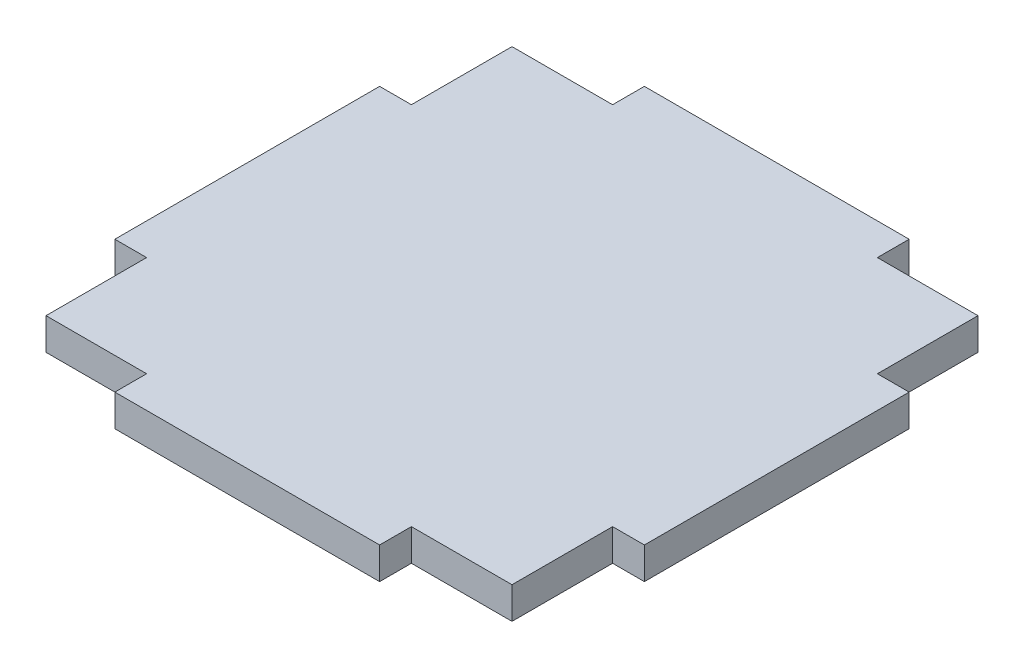
ISO-10303-21;
HEADER;
FILE_DESCRIPTION(('STEP AP214'),'2;1');
FILE_NAME('part.step','',(''),(''),'','','');
FILE_SCHEMA(('AUTOMOTIVE_DESIGN { 1 0 10303 214 1 1 1 1 }'));
ENDSEC;
DATA;
#1=APPLICATION_CONTEXT('core data for automotive mechanical design processes');
#2=APPLICATION_PROTOCOL_DEFINITION('international standard','automotive_design',2000,#1);
#3=PRODUCT_CONTEXT('',#1,'mechanical');
#4=PRODUCT('Part','Part','',(#3));
#5=PRODUCT_RELATED_PRODUCT_CATEGORY('part','',(#4));
#6=PRODUCT_DEFINITION_FORMATION('','',#4);
#7=PRODUCT_DEFINITION_CONTEXT('part definition',#1,'design');
#8=PRODUCT_DEFINITION('design','',#6,#7);
#9=PRODUCT_DEFINITION_SHAPE('','',#8);
#10=(LENGTH_UNIT() NAMED_UNIT(*) SI_UNIT(.MILLI.,.METRE.));
#11=(NAMED_UNIT(*) PLANE_ANGLE_UNIT() SI_UNIT($,.RADIAN.));
#12=(NAMED_UNIT(*) SI_UNIT($,.STERADIAN.) SOLID_ANGLE_UNIT());
#13=UNCERTAINTY_MEASURE_WITH_UNIT(LENGTH_MEASURE(1.E-05),#10,'distance_accuracy_value','');
#14=(GEOMETRIC_REPRESENTATION_CONTEXT(3) GLOBAL_UNCERTAINTY_ASSIGNED_CONTEXT((#13)) GLOBAL_UNIT_ASSIGNED_CONTEXT((#10,
#11,#12)) REPRESENTATION_CONTEXT('',''));
#15=CARTESIAN_POINT('',(0.,0.,0.));
#16=DIRECTION('',(0.,0.,1.));
#17=DIRECTION('',(1.,0.,0.));
#18=AXIS2_PLACEMENT_3D('',#15,#16,#17);
#19=CARTESIAN_POINT('',(0.,3.,0.));
#20=DIRECTION('',(1.,0.,0.));
#21=DIRECTION('',(0.,0.,-1.));
#22=AXIS2_PLACEMENT_3D('',#19,#20,#21);
#23=PLANE('',#22);
#24=DIRECTION('',(0.,0.,1.));
#25=VECTOR('',#24,1.);
#26=CARTESIAN_POINT('',(0.,0.,0.));
#27=LINE('',#26,#25);
#28=CARTESIAN_POINT('',(0.,0.,-37.5));
#29=VERTEX_POINT('',#28);
#30=CARTESIAN_POINT('',(0.,0.,-12.5));
#31=VERTEX_POINT('',#30);
#32=EDGE_CURVE('E201',#29,#31,#27,.T.);
#33=ORIENTED_EDGE('',*,*,#32,.T.);
#34=DIRECTION('',(0.,1.,0.));
#35=VECTOR('',#34,1.);
#36=CARTESIAN_POINT('',(0.,0.,-12.5));
#37=LINE('',#36,#35);
#38=CARTESIAN_POINT('',(0.,3.,-12.5));
#39=VERTEX_POINT('',#38);
#40=EDGE_CURVE('E237',#31,#39,#37,.T.);
#41=ORIENTED_EDGE('',*,*,#40,.T.);
#42=DIRECTION('',(0.,0.,1.));
#43=VECTOR('',#42,1.);
#44=CARTESIAN_POINT('',(0.,3.,0.));
#45=LINE('',#44,#43);
#46=CARTESIAN_POINT('',(0.,3.,-37.5));
#47=VERTEX_POINT('',#46);
#48=EDGE_CURVE('E211',#47,#39,#45,.T.);
#49=ORIENTED_EDGE('',*,*,#48,.F.);
#50=DIRECTION('',(0.,1.,0.));
#51=VECTOR('',#50,1.);
#52=CARTESIAN_POINT('',(0.,0.,-37.5));
#53=LINE('',#52,#51);
#54=EDGE_CURVE('E214',#29,#47,#53,.T.);
#55=ORIENTED_EDGE('',*,*,#54,.F.);
#56=EDGE_LOOP('',(#33,#41,#49,#55));
#57=FACE_BOUND('',#56,.T.);
#58=ADVANCED_FACE('F33',(#57),#23,.F.);
#59=CARTESIAN_POINT('',(0.,3.,0.));
#60=DIRECTION('',(0.,0.,-1.));
#61=DIRECTION('',(-1.,0.,0.));
#62=AXIS2_PLACEMENT_3D('',#59,#60,#61);
#63=PLANE('',#62);
#64=DIRECTION('',(1.,0.,0.));
#65=VECTOR('',#64,1.);
#66=CARTESIAN_POINT('',(0.,0.,0.));
#67=LINE('',#66,#65);
#68=CARTESIAN_POINT('',(12.5,0.,0.));
#69=VERTEX_POINT('',#68);
#70=CARTESIAN_POINT('',(37.5,0.,0.));
#71=VERTEX_POINT('',#70);
#72=EDGE_CURVE('E189',#69,#71,#67,.T.);
#73=ORIENTED_EDGE('',*,*,#72,.T.);
#74=DIRECTION('',(0.,1.,0.));
#75=VECTOR('',#74,1.);
#76=CARTESIAN_POINT('',(37.5,0.,0.));
#77=LINE('',#76,#75);
#78=CARTESIAN_POINT('',(37.5,3.,0.));
#79=VERTEX_POINT('',#78);
#80=EDGE_CURVE('E288',#71,#79,#77,.T.);
#81=ORIENTED_EDGE('',*,*,#80,.T.);
#82=DIRECTION('',(1.,0.,0.));
#83=VECTOR('',#82,1.);
#84=CARTESIAN_POINT('',(0.,3.,0.));
#85=LINE('',#84,#83);
#86=CARTESIAN_POINT('',(12.5,3.,0.));
#87=VERTEX_POINT('',#86);
#88=EDGE_CURVE('E191',#87,#79,#85,.T.);
#89=ORIENTED_EDGE('',*,*,#88,.F.);
#90=DIRECTION('',(0.,1.,0.));
#91=VECTOR('',#90,1.);
#92=CARTESIAN_POINT('',(12.5,0.,0.));
#93=LINE('',#92,#91);
#94=EDGE_CURVE('E175',#69,#87,#93,.T.);
#95=ORIENTED_EDGE('',*,*,#94,.F.);
#96=EDGE_LOOP('',(#73,#81,#89,#95));
#97=FACE_BOUND('',#96,.T.);
#98=ADVANCED_FACE('F187',(#97),#63,.F.);
#99=CARTESIAN_POINT('',(50.,3.,0.));
#100=DIRECTION('',(-1.,0.,0.));
#101=DIRECTION('',(0.,0.,1.));
#102=AXIS2_PLACEMENT_3D('',#99,#100,#101);
#103=PLANE('',#102);
#104=DIRECTION('',(0.,0.,-1.));
#105=VECTOR('',#104,1.);
#106=CARTESIAN_POINT('',(50.,0.,0.));
#107=LINE('',#106,#105);
#108=CARTESIAN_POINT('',(50.,0.,-12.5));
#109=VERTEX_POINT('',#108);
#110=CARTESIAN_POINT('',(50.,0.,-37.5));
#111=VERTEX_POINT('',#110);
#112=EDGE_CURVE('E200',#109,#111,#107,.T.);
#113=ORIENTED_EDGE('',*,*,#112,.T.);
#114=DIRECTION('',(0.,1.,0.));
#115=VECTOR('',#114,1.);
#116=CARTESIAN_POINT('',(50.,0.,-37.5));
#117=LINE('',#116,#115);
#118=CARTESIAN_POINT('',(50.,3.,-37.5));
#119=VERTEX_POINT('',#118);
#120=EDGE_CURVE('E257',#111,#119,#117,.T.);
#121=ORIENTED_EDGE('',*,*,#120,.T.);
#122=DIRECTION('',(0.,0.,-1.));
#123=VECTOR('',#122,1.);
#124=CARTESIAN_POINT('',(50.,3.,0.));
#125=LINE('',#124,#123);
#126=CARTESIAN_POINT('',(50.,3.,-12.5));
#127=VERTEX_POINT('',#126);
#128=EDGE_CURVE('E41',#127,#119,#125,.T.);
#129=ORIENTED_EDGE('',*,*,#128,.F.);
#130=DIRECTION('',(0.,1.,0.));
#131=VECTOR('',#130,1.);
#132=CARTESIAN_POINT('',(50.,0.,-12.5));
#133=LINE('',#132,#131);
#134=EDGE_CURVE('E280',#109,#127,#133,.T.);
#135=ORIENTED_EDGE('',*,*,#134,.F.);
#136=EDGE_LOOP('',(#113,#121,#129,#135));
#137=FACE_BOUND('',#136,.T.);
#138=ADVANCED_FACE('F381',(#137),#103,.F.);
#139=CARTESIAN_POINT('',(0.,3.,-50.));
#140=DIRECTION('',(0.,0.,1.));
#141=DIRECTION('',(1.,0.,0.));
#142=AXIS2_PLACEMENT_3D('',#139,#140,#141);
#143=PLANE('',#142);
#144=DIRECTION('',(-1.,0.,0.));
#145=VECTOR('',#144,1.);
#146=CARTESIAN_POINT('',(0.,3.,-50.));
#147=LINE('',#146,#145);
#148=CARTESIAN_POINT('',(37.5,3.,-50.));
#149=VERTEX_POINT('',#148);
#150=CARTESIAN_POINT('',(12.5,3.,-50.));
#151=VERTEX_POINT('',#150);
#152=EDGE_CURVE('E11',#149,#151,#147,.T.);
#153=ORIENTED_EDGE('',*,*,#152,.F.);
#154=DIRECTION('',(0.,1.,0.));
#155=VECTOR('',#154,1.);
#156=CARTESIAN_POINT('',(37.5,0.,-50.));
#157=LINE('',#156,#155);
#158=CARTESIAN_POINT('',(37.5,0.,-50.));
#159=VERTEX_POINT('',#158);
#160=EDGE_CURVE('E248',#159,#149,#157,.T.);
#161=ORIENTED_EDGE('',*,*,#160,.F.);
#162=DIRECTION('',(-1.,0.,0.));
#163=VECTOR('',#162,1.);
#164=CARTESIAN_POINT('',(0.,0.,-50.));
#165=LINE('',#164,#163);
#166=CARTESIAN_POINT('',(12.5,0.,-50.));
#167=VERTEX_POINT('',#166);
#168=EDGE_CURVE('E36',#159,#167,#165,.T.);
#169=ORIENTED_EDGE('',*,*,#168,.T.);
#170=DIRECTION('',(0.,1.,0.));
#171=VECTOR('',#170,1.);
#172=CARTESIAN_POINT('',(12.5,0.,-50.));
#173=LINE('',#172,#171);
#174=EDGE_CURVE('E205',#167,#151,#173,.T.);
#175=ORIENTED_EDGE('',*,*,#174,.T.);
#176=EDGE_LOOP('',(#153,#161,#169,#175));
#177=FACE_BOUND('',#176,.T.);
#178=ADVANCED_FACE('F364',(#177),#143,.F.);
#179=CARTESIAN_POINT('',(0.,3.,0.));
#180=DIRECTION('',(0.,-1.,0.));
#181=DIRECTION('',(0.,0.,-1.));
#182=AXIS2_PLACEMENT_3D('',#179,#180,#181);
#183=PLANE('',#182);
#184=ORIENTED_EDGE('',*,*,#128,.T.);
#185=DIRECTION('',(1.,0.,0.));
#186=VECTOR('',#185,1.);
#187=CARTESIAN_POINT('',(50.,3.,-37.5));
#188=LINE('',#187,#186);
#189=CARTESIAN_POINT('',(47.,3.,-37.5));
#190=VERTEX_POINT('',#189);
#191=EDGE_CURVE('E261',#190,#119,#188,.T.);
#192=ORIENTED_EDGE('',*,*,#191,.F.);
#193=DIRECTION('',(0.,0.,1.));
#194=VECTOR('',#193,1.);
#195=CARTESIAN_POINT('',(47.,3.,-37.5));
#196=LINE('',#195,#194);
#197=CARTESIAN_POINT('',(47.,3.,-47.));
#198=VERTEX_POINT('',#197);
#199=EDGE_CURVE('E264',#198,#190,#196,.T.);
#200=ORIENTED_EDGE('',*,*,#199,.F.);
#201=DIRECTION('',(1.,0.,0.));
#202=VECTOR('',#201,1.);
#203=CARTESIAN_POINT('',(37.5,3.,-47.));
#204=LINE('',#203,#202);
#205=CARTESIAN_POINT('',(37.5,3.,-47.));
#206=VERTEX_POINT('',#205);
#207=EDGE_CURVE('E267',#206,#198,#204,.T.);
#208=ORIENTED_EDGE('',*,*,#207,.F.);
#209=DIRECTION('',(0.,0.,1.));
#210=VECTOR('',#209,1.);
#211=CARTESIAN_POINT('',(37.5,3.,-50.));
#212=LINE('',#211,#210);
#213=EDGE_CURVE('E270',#149,#206,#212,.T.);
#214=ORIENTED_EDGE('',*,*,#213,.F.);
#215=ORIENTED_EDGE('',*,*,#152,.T.);
#216=DIRECTION('',(0.,0.,-1.));
#217=VECTOR('',#216,1.);
#218=CARTESIAN_POINT('',(12.5,3.,-50.));
#219=LINE('',#218,#217);
#220=CARTESIAN_POINT('',(12.5,3.,-47.));
#221=VERTEX_POINT('',#220);
#222=EDGE_CURVE('E225',#221,#151,#219,.T.);
#223=ORIENTED_EDGE('',*,*,#222,.F.);
#224=DIRECTION('',(1.,0.,0.));
#225=VECTOR('',#224,1.);
#226=CARTESIAN_POINT('',(12.5,3.,-47.));
#227=LINE('',#226,#225);
#228=CARTESIAN_POINT('',(3.,3.,-47.));
#229=VERTEX_POINT('',#228);
#230=EDGE_CURVE('E228',#229,#221,#227,.T.);
#231=ORIENTED_EDGE('',*,*,#230,.F.);
#232=DIRECTION('',(0.,0.,-1.));
#233=VECTOR('',#232,1.);
#234=CARTESIAN_POINT('',(3.,3.,-37.5));
#235=LINE('',#234,#233);
#236=CARTESIAN_POINT('',(3.,3.,-37.5));
#237=VERTEX_POINT('',#236);
#238=EDGE_CURVE('E231',#237,#229,#235,.T.);
#239=ORIENTED_EDGE('',*,*,#238,.F.);
#240=DIRECTION('',(1.,0.,0.));
#241=VECTOR('',#240,1.);
#242=CARTESIAN_POINT('',(0.,3.,-37.5));
#243=LINE('',#242,#241);
#244=EDGE_CURVE('E234',#47,#237,#243,.T.);
#245=ORIENTED_EDGE('',*,*,#244,.F.);
#246=ORIENTED_EDGE('',*,*,#48,.T.);
#247=DIRECTION('',(-1.,0.,0.));
#248=VECTOR('',#247,1.);
#249=CARTESIAN_POINT('',(0.,3.,-12.5));
#250=LINE('',#249,#248);
#251=CARTESIAN_POINT('',(3.,3.,-12.5));
#252=VERTEX_POINT('',#251);
#253=EDGE_CURVE('E182',#252,#39,#250,.T.);
#254=ORIENTED_EDGE('',*,*,#253,.F.);
#255=DIRECTION('',(0.,0.,-1.));
#256=VECTOR('',#255,1.);
#257=CARTESIAN_POINT('',(3.,3.,-12.5));
#258=LINE('',#257,#256);
#259=CARTESIAN_POINT('',(3.,3.,-3.));
#260=VERTEX_POINT('',#259);
#261=EDGE_CURVE('E316',#260,#252,#258,.T.);
#262=ORIENTED_EDGE('',*,*,#261,.F.);
#263=DIRECTION('',(-1.,0.,0.));
#264=VECTOR('',#263,1.);
#265=CARTESIAN_POINT('',(12.5,3.,-3.));
#266=LINE('',#265,#264);
#267=CARTESIAN_POINT('',(12.5,3.,-3.));
#268=VERTEX_POINT('',#267);
#269=EDGE_CURVE('E319',#268,#260,#266,.T.);
#270=ORIENTED_EDGE('',*,*,#269,.F.);
#271=DIRECTION('',(0.,0.,-1.));
#272=VECTOR('',#271,1.);
#273=CARTESIAN_POINT('',(12.5,3.,0.));
#274=LINE('',#273,#272);
#275=EDGE_CURVE('E290',#87,#268,#274,.T.);
#276=ORIENTED_EDGE('',*,*,#275,.F.);
#277=ORIENTED_EDGE('',*,*,#88,.T.);
#278=DIRECTION('',(0.,0.,1.));
#279=VECTOR('',#278,1.);
#280=CARTESIAN_POINT('',(37.5,3.,0.));
#281=LINE('',#280,#279);
#282=CARTESIAN_POINT('',(37.5,3.,-3.));
#283=VERTEX_POINT('',#282);
#284=EDGE_CURVE('E291',#283,#79,#281,.T.);
#285=ORIENTED_EDGE('',*,*,#284,.F.);
#286=DIRECTION('',(-1.,0.,0.));
#287=VECTOR('',#286,1.);
#288=CARTESIAN_POINT('',(37.5,3.,-3.));
#289=LINE('',#288,#287);
#290=CARTESIAN_POINT('',(47.,3.,-3.));
#291=VERTEX_POINT('',#290);
#292=EDGE_CURVE('E294',#291,#283,#289,.T.);
#293=ORIENTED_EDGE('',*,*,#292,.F.);
#294=DIRECTION('',(0.,0.,1.));
#295=VECTOR('',#294,1.);
#296=CARTESIAN_POINT('',(47.,3.,-12.5));
#297=LINE('',#296,#295);
#298=CARTESIAN_POINT('',(47.,3.,-12.5));
#299=VERTEX_POINT('',#298);
#300=EDGE_CURVE('E297',#299,#291,#297,.T.);
#301=ORIENTED_EDGE('',*,*,#300,.F.);
#302=DIRECTION('',(-1.,0.,0.));
#303=VECTOR('',#302,1.);
#304=CARTESIAN_POINT('',(50.,3.,-12.5));
#305=LINE('',#304,#303);
#306=EDGE_CURVE('E260',#127,#299,#305,.T.);
#307=ORIENTED_EDGE('',*,*,#306,.F.);
#308=EDGE_LOOP('',(#184,#192,#200,#208,#214,#215,#223,#231,#239,#245,#246,#254,#262,#270,#276,
#277,#285,#293,#301,#307));
#309=FACE_BOUND('',#308,.T.);
#310=ADVANCED_FACE('F349',(#309),#183,.F.);
#311=CARTESIAN_POINT('',(0.,0.,0.));
#312=DIRECTION('',(0.,-1.,0.));
#313=DIRECTION('',(0.,0.,-1.));
#314=AXIS2_PLACEMENT_3D('',#311,#312,#313);
#315=PLANE('',#314);
#316=DIRECTION('',(1.,0.,0.));
#317=VECTOR('',#316,1.);
#318=CARTESIAN_POINT('',(50.,0.,-37.5));
#319=LINE('',#318,#317);
#320=CARTESIAN_POINT('',(47.,0.,-37.5));
#321=VERTEX_POINT('',#320);
#322=EDGE_CURVE('E251',#321,#111,#319,.T.);
#323=ORIENTED_EDGE('',*,*,#322,.T.);
#324=ORIENTED_EDGE('',*,*,#112,.F.);
#325=DIRECTION('',(-1.,0.,0.));
#326=VECTOR('',#325,1.);
#327=CARTESIAN_POINT('',(50.,0.,-12.5));
#328=LINE('',#327,#326);
#329=CARTESIAN_POINT('',(47.,0.,-12.5));
#330=VERTEX_POINT('',#329);
#331=EDGE_CURVE('E293',#109,#330,#328,.T.);
#332=ORIENTED_EDGE('',*,*,#331,.T.);
#333=DIRECTION('',(0.,0.,1.));
#334=VECTOR('',#333,1.);
#335=CARTESIAN_POINT('',(47.,0.,-12.5));
#336=LINE('',#335,#334);
#337=CARTESIAN_POINT('',(47.,0.,-3.));
#338=VERTEX_POINT('',#337);
#339=EDGE_CURVE('E57',#330,#338,#336,.T.);
#340=ORIENTED_EDGE('',*,*,#339,.T.);
#341=DIRECTION('',(-1.,0.,0.));
#342=VECTOR('',#341,1.);
#343=CARTESIAN_POINT('',(37.5,0.,-3.));
#344=LINE('',#343,#342);
#345=CARTESIAN_POINT('',(37.5,0.,-3.));
#346=VERTEX_POINT('',#345);
#347=EDGE_CURVE('E303',#338,#346,#344,.T.);
#348=ORIENTED_EDGE('',*,*,#347,.T.);
#349=DIRECTION('',(0.,0.,1.));
#350=VECTOR('',#349,1.);
#351=CARTESIAN_POINT('',(37.5,0.,0.));
#352=LINE('',#351,#350);
#353=EDGE_CURVE('E199',#346,#71,#352,.T.);
#354=ORIENTED_EDGE('',*,*,#353,.T.);
#355=ORIENTED_EDGE('',*,*,#72,.F.);
#356=DIRECTION('',(0.,0.,-1.));
#357=VECTOR('',#356,1.);
#358=CARTESIAN_POINT('',(12.5,0.,0.));
#359=LINE('',#358,#357);
#360=CARTESIAN_POINT('',(12.5,0.,-3.));
#361=VERTEX_POINT('',#360);
#362=EDGE_CURVE('E171',#69,#361,#359,.T.);
#363=ORIENTED_EDGE('',*,*,#362,.T.);
#364=DIRECTION('',(-1.,0.,0.));
#365=VECTOR('',#364,1.);
#366=CARTESIAN_POINT('',(12.5,0.,-3.));
#367=LINE('',#366,#365);
#368=CARTESIAN_POINT('',(3.,0.,-3.));
#369=VERTEX_POINT('',#368);
#370=EDGE_CURVE('E181',#361,#369,#367,.T.);
#371=ORIENTED_EDGE('',*,*,#370,.T.);
#372=DIRECTION('',(0.,0.,-1.));
#373=VECTOR('',#372,1.);
#374=CARTESIAN_POINT('',(3.,0.,-12.5));
#375=LINE('',#374,#373);
#376=CARTESIAN_POINT('',(3.,0.,-12.5));
#377=VERTEX_POINT('',#376);
#378=EDGE_CURVE('E325',#369,#377,#375,.T.);
#379=ORIENTED_EDGE('',*,*,#378,.T.);
#380=DIRECTION('',(-1.,0.,0.));
#381=VECTOR('',#380,1.);
#382=CARTESIAN_POINT('',(0.,0.,-12.5));
#383=LINE('',#382,#381);
#384=EDGE_CURVE('E192',#377,#31,#383,.T.);
#385=ORIENTED_EDGE('',*,*,#384,.T.);
#386=ORIENTED_EDGE('',*,*,#32,.F.);
#387=DIRECTION('',(1.,0.,0.));
#388=VECTOR('',#387,1.);
#389=CARTESIAN_POINT('',(0.,0.,-37.5));
#390=LINE('',#389,#388);
#391=CARTESIAN_POINT('',(3.,0.,-37.5));
#392=VERTEX_POINT('',#391);
#393=EDGE_CURVE('E227',#29,#392,#390,.T.);
#394=ORIENTED_EDGE('',*,*,#393,.T.);
#395=DIRECTION('',(0.,0.,-1.));
#396=VECTOR('',#395,1.);
#397=CARTESIAN_POINT('',(3.,0.,-37.5));
#398=LINE('',#397,#396);
#399=CARTESIAN_POINT('',(3.,0.,-47.));
#400=VERTEX_POINT('',#399);
#401=EDGE_CURVE('E243',#392,#400,#398,.T.);
#402=ORIENTED_EDGE('',*,*,#401,.T.);
#403=DIRECTION('',(1.,0.,0.));
#404=VECTOR('',#403,1.);
#405=CARTESIAN_POINT('',(12.5,0.,-47.));
#406=LINE('',#405,#404);
#407=CARTESIAN_POINT('',(12.5,0.,-47.));
#408=VERTEX_POINT('',#407);
#409=EDGE_CURVE('E240',#400,#408,#406,.T.);
#410=ORIENTED_EDGE('',*,*,#409,.T.);
#411=DIRECTION('',(0.,0.,-1.));
#412=VECTOR('',#411,1.);
#413=CARTESIAN_POINT('',(12.5,0.,-50.));
#414=LINE('',#413,#412);
#415=EDGE_CURVE('E217',#408,#167,#414,.T.);
#416=ORIENTED_EDGE('',*,*,#415,.T.);
#417=ORIENTED_EDGE('',*,*,#168,.F.);
#418=DIRECTION('',(0.,0.,1.));
#419=VECTOR('',#418,1.);
#420=CARTESIAN_POINT('',(37.5,0.,-50.));
#421=LINE('',#420,#419);
#422=CARTESIAN_POINT('',(37.5,0.,-47.));
#423=VERTEX_POINT('',#422);
#424=EDGE_CURVE('E263',#159,#423,#421,.T.);
#425=ORIENTED_EDGE('',*,*,#424,.T.);
#426=DIRECTION('',(1.,0.,0.));
#427=VECTOR('',#426,1.);
#428=CARTESIAN_POINT('',(37.5,0.,-47.));
#429=LINE('',#428,#427);
#430=CARTESIAN_POINT('',(47.,0.,-47.));
#431=VERTEX_POINT('',#430);
#432=EDGE_CURVE('E49',#423,#431,#429,.T.);
#433=ORIENTED_EDGE('',*,*,#432,.T.);
#434=DIRECTION('',(0.,0.,1.));
#435=VECTOR('',#434,1.);
#436=CARTESIAN_POINT('',(47.,0.,-37.5));
#437=LINE('',#436,#435);
#438=EDGE_CURVE('E274',#431,#321,#437,.T.);
#439=ORIENTED_EDGE('',*,*,#438,.T.);
#440=EDGE_LOOP('',(#323,#324,#332,#340,#348,#354,#355,#363,#371,#379,#385,#386,#394,#402,#410,
#416,#417,#425,#433,#439));
#441=FACE_BOUND('',#440,.T.);
#442=ADVANCED_FACE('F196',(#441),#315,.T.);
#443=CARTESIAN_POINT('',(12.5,0.,-50.));
#444=DIRECTION('',(1.,0.,0.));
#445=DIRECTION('',(0.,0.,-1.));
#446=AXIS2_PLACEMENT_3D('',#443,#444,#445);
#447=PLANE('',#446);
#448=ORIENTED_EDGE('',*,*,#222,.T.);
#449=ORIENTED_EDGE('',*,*,#174,.F.);
#450=ORIENTED_EDGE('',*,*,#415,.F.);
#451=DIRECTION('',(0.,1.,0.));
#452=VECTOR('',#451,1.);
#453=CARTESIAN_POINT('',(12.5,0.,-47.));
#454=LINE('',#453,#452);
#455=EDGE_CURVE('E221',#408,#221,#454,.T.);
#456=ORIENTED_EDGE('',*,*,#455,.T.);
#457=EDGE_LOOP('',(#448,#449,#450,#456));
#458=FACE_BOUND('',#457,.T.);
#459=ADVANCED_FACE('F361',(#458),#447,.F.);
#460=CARTESIAN_POINT('',(12.5,0.,-47.));
#461=DIRECTION('',(0.,0.,1.));
#462=DIRECTION('',(1.,0.,0.));
#463=AXIS2_PLACEMENT_3D('',#460,#461,#462);
#464=PLANE('',#463);
#465=ORIENTED_EDGE('',*,*,#230,.T.);
#466=ORIENTED_EDGE('',*,*,#455,.F.);
#467=ORIENTED_EDGE('',*,*,#409,.F.);
#468=DIRECTION('',(0.,1.,0.));
#469=VECTOR('',#468,1.);
#470=CARTESIAN_POINT('',(3.,0.,-47.));
#471=LINE('',#470,#469);
#472=EDGE_CURVE('E219',#400,#229,#471,.T.);
#473=ORIENTED_EDGE('',*,*,#472,.T.);
#474=EDGE_LOOP('',(#465,#466,#467,#473));
#475=FACE_BOUND('',#474,.T.);
#476=ADVANCED_FACE('F359',(#475),#464,.F.);
#477=CARTESIAN_POINT('',(3.,0.,-37.5));
#478=DIRECTION('',(1.,0.,0.));
#479=DIRECTION('',(0.,0.,-1.));
#480=AXIS2_PLACEMENT_3D('',#477,#478,#479);
#481=PLANE('',#480);
#482=ORIENTED_EDGE('',*,*,#238,.T.);
#483=ORIENTED_EDGE('',*,*,#472,.F.);
#484=ORIENTED_EDGE('',*,*,#401,.F.);
#485=DIRECTION('',(0.,1.,0.));
#486=VECTOR('',#485,1.);
#487=CARTESIAN_POINT('',(3.,0.,-37.5));
#488=LINE('',#487,#486);
#489=EDGE_CURVE('E216',#392,#237,#488,.T.);
#490=ORIENTED_EDGE('',*,*,#489,.T.);
#491=EDGE_LOOP('',(#482,#483,#484,#490));
#492=FACE_BOUND('',#491,.T.);
#493=ADVANCED_FACE('F353',(#492),#481,.F.);
#494=CARTESIAN_POINT('',(0.,0.,-37.5));
#495=DIRECTION('',(0.,0.,1.));
#496=DIRECTION('',(1.,0.,0.));
#497=AXIS2_PLACEMENT_3D('',#494,#495,#496);
#498=PLANE('',#497);
#499=ORIENTED_EDGE('',*,*,#244,.T.);
#500=ORIENTED_EDGE('',*,*,#489,.F.);
#501=ORIENTED_EDGE('',*,*,#393,.F.);
#502=ORIENTED_EDGE('',*,*,#54,.T.);
#503=EDGE_LOOP('',(#499,#500,#501,#502));
#504=FACE_BOUND('',#503,.T.);
#505=ADVANCED_FACE('F345',(#504),#498,.F.);
#506=CARTESIAN_POINT('',(0.,0.,-12.5));
#507=DIRECTION('',(0.,0.,-1.));
#508=DIRECTION('',(-1.,0.,0.));
#509=AXIS2_PLACEMENT_3D('',#506,#507,#508);
#510=PLANE('',#509);
#511=ORIENTED_EDGE('',*,*,#253,.T.);
#512=ORIENTED_EDGE('',*,*,#40,.F.);
#513=ORIENTED_EDGE('',*,*,#384,.F.);
#514=DIRECTION('',(0.,1.,0.));
#515=VECTOR('',#514,1.);
#516=CARTESIAN_POINT('',(3.,0.,-12.5));
#517=LINE('',#516,#515);
#518=EDGE_CURVE('E311',#377,#252,#517,.T.);
#519=ORIENTED_EDGE('',*,*,#518,.T.);
#520=EDGE_LOOP('',(#511,#512,#513,#519));
#521=FACE_BOUND('',#520,.T.);
#522=ADVANCED_FACE('F338',(#521),#510,.F.);
#523=CARTESIAN_POINT('',(3.,0.,-12.5));
#524=DIRECTION('',(1.,0.,0.));
#525=DIRECTION('',(0.,0.,-1.));
#526=AXIS2_PLACEMENT_3D('',#523,#524,#525);
#527=PLANE('',#526);
#528=ORIENTED_EDGE('',*,*,#261,.T.);
#529=ORIENTED_EDGE('',*,*,#518,.F.);
#530=ORIENTED_EDGE('',*,*,#378,.F.);
#531=DIRECTION('',(0.,1.,0.));
#532=VECTOR('',#531,1.);
#533=CARTESIAN_POINT('',(3.,0.,-3.));
#534=LINE('',#533,#532);
#535=EDGE_CURVE('E309',#369,#260,#534,.T.);
#536=ORIENTED_EDGE('',*,*,#535,.T.);
#537=EDGE_LOOP('',(#528,#529,#530,#536));
#538=FACE_BOUND('',#537,.T.);
#539=ADVANCED_FACE('F334',(#538),#527,.F.);
#540=CARTESIAN_POINT('',(12.5,0.,-3.));
#541=DIRECTION('',(0.,0.,-1.));
#542=DIRECTION('',(-1.,0.,0.));
#543=AXIS2_PLACEMENT_3D('',#540,#541,#542);
#544=PLANE('',#543);
#545=ORIENTED_EDGE('',*,*,#269,.T.);
#546=ORIENTED_EDGE('',*,*,#535,.F.);
#547=ORIENTED_EDGE('',*,*,#370,.F.);
#548=DIRECTION('',(0.,1.,0.));
#549=VECTOR('',#548,1.);
#550=CARTESIAN_POINT('',(12.5,0.,-3.));
#551=LINE('',#550,#549);
#552=EDGE_CURVE('E177',#361,#268,#551,.T.);
#553=ORIENTED_EDGE('',*,*,#552,.T.);
#554=EDGE_LOOP('',(#545,#546,#547,#553));
#555=FACE_BOUND('',#554,.T.);
#556=ADVANCED_FACE('F330',(#555),#544,.F.);
#557=CARTESIAN_POINT('',(12.5,0.,0.));
#558=DIRECTION('',(1.,0.,0.));
#559=DIRECTION('',(0.,0.,-1.));
#560=AXIS2_PLACEMENT_3D('',#557,#558,#559);
#561=PLANE('',#560);
#562=ORIENTED_EDGE('',*,*,#275,.T.);
#563=ORIENTED_EDGE('',*,*,#552,.F.);
#564=ORIENTED_EDGE('',*,*,#362,.F.);
#565=ORIENTED_EDGE('',*,*,#94,.T.);
#566=EDGE_LOOP('',(#562,#563,#564,#565));
#567=FACE_BOUND('',#566,.T.);
#568=ADVANCED_FACE('F174',(#567),#561,.F.);
#569=CARTESIAN_POINT('',(37.5,0.,0.));
#570=DIRECTION('',(-1.,0.,0.));
#571=DIRECTION('',(0.,0.,1.));
#572=AXIS2_PLACEMENT_3D('',#569,#570,#571);
#573=PLANE('',#572);
#574=ORIENTED_EDGE('',*,*,#284,.T.);
#575=ORIENTED_EDGE('',*,*,#80,.F.);
#576=ORIENTED_EDGE('',*,*,#353,.F.);
#577=DIRECTION('',(0.,1.,0.));
#578=VECTOR('',#577,1.);
#579=CARTESIAN_POINT('',(37.5,0.,-3.));
#580=LINE('',#579,#578);
#581=EDGE_CURVE('E286',#346,#283,#580,.T.);
#582=ORIENTED_EDGE('',*,*,#581,.T.);
#583=EDGE_LOOP('',(#574,#575,#576,#582));
#584=FACE_BOUND('',#583,.T.);
#585=ADVANCED_FACE('F393',(#584),#573,.F.);
#586=CARTESIAN_POINT('',(37.5,0.,-3.));
#587=DIRECTION('',(0.,0.,-1.));
#588=DIRECTION('',(-1.,0.,0.));
#589=AXIS2_PLACEMENT_3D('',#586,#587,#588);
#590=PLANE('',#589);
#591=ORIENTED_EDGE('',*,*,#292,.T.);
#592=ORIENTED_EDGE('',*,*,#581,.F.);
#593=ORIENTED_EDGE('',*,*,#347,.F.);
#594=DIRECTION('',(0.,1.,0.));
#595=VECTOR('',#594,1.);
#596=CARTESIAN_POINT('',(47.,0.,-3.));
#597=LINE('',#596,#595);
#598=EDGE_CURVE('E284',#338,#291,#597,.T.);
#599=ORIENTED_EDGE('',*,*,#598,.T.);
#600=EDGE_LOOP('',(#591,#592,#593,#599));
#601=FACE_BOUND('',#600,.T.);
#602=ADVANCED_FACE('F390',(#601),#590,.F.);
#603=CARTESIAN_POINT('',(47.,0.,-12.5));
#604=DIRECTION('',(-1.,0.,0.));
#605=DIRECTION('',(0.,0.,1.));
#606=AXIS2_PLACEMENT_3D('',#603,#604,#605);
#607=PLANE('',#606);
#608=ORIENTED_EDGE('',*,*,#300,.T.);
#609=ORIENTED_EDGE('',*,*,#598,.F.);
#610=ORIENTED_EDGE('',*,*,#339,.F.);
#611=DIRECTION('',(0.,1.,0.));
#612=VECTOR('',#611,1.);
#613=CARTESIAN_POINT('',(47.,0.,-12.5));
#614=LINE('',#613,#612);
#615=EDGE_CURVE('E282',#330,#299,#614,.T.);
#616=ORIENTED_EDGE('',*,*,#615,.T.);
#617=EDGE_LOOP('',(#608,#609,#610,#616));
#618=FACE_BOUND('',#617,.T.);
#619=ADVANCED_FACE('F400',(#618),#607,.F.);
#620=CARTESIAN_POINT('',(50.,0.,-12.5));
#621=DIRECTION('',(0.,0.,-1.));
#622=DIRECTION('',(-1.,0.,0.));
#623=AXIS2_PLACEMENT_3D('',#620,#621,#622);
#624=PLANE('',#623);
#625=ORIENTED_EDGE('',*,*,#306,.T.);
#626=ORIENTED_EDGE('',*,*,#615,.F.);
#627=ORIENTED_EDGE('',*,*,#331,.F.);
#628=ORIENTED_EDGE('',*,*,#134,.T.);
#629=EDGE_LOOP('',(#625,#626,#627,#628));
#630=FACE_BOUND('',#629,.T.);
#631=ADVANCED_FACE('F387',(#630),#624,.F.);
#632=CARTESIAN_POINT('',(50.,0.,-37.5));
#633=DIRECTION('',(0.,0.,1.));
#634=DIRECTION('',(1.,0.,0.));
#635=AXIS2_PLACEMENT_3D('',#632,#633,#634);
#636=PLANE('',#635);
#637=ORIENTED_EDGE('',*,*,#191,.T.);
#638=ORIENTED_EDGE('',*,*,#120,.F.);
#639=ORIENTED_EDGE('',*,*,#322,.F.);
#640=DIRECTION('',(0.,1.,0.));
#641=VECTOR('',#640,1.);
#642=CARTESIAN_POINT('',(47.,0.,-37.5));
#643=LINE('',#642,#641);
#644=EDGE_CURVE('E255',#321,#190,#643,.T.);
#645=ORIENTED_EDGE('',*,*,#644,.T.);
#646=EDGE_LOOP('',(#637,#638,#639,#645));
#647=FACE_BOUND('',#646,.T.);
#648=ADVANCED_FACE('F378',(#647),#636,.F.);
#649=CARTESIAN_POINT('',(47.,0.,-37.5));
#650=DIRECTION('',(-1.,0.,0.));
#651=DIRECTION('',(0.,0.,1.));
#652=AXIS2_PLACEMENT_3D('',#649,#650,#651);
#653=PLANE('',#652);
#654=ORIENTED_EDGE('',*,*,#199,.T.);
#655=ORIENTED_EDGE('',*,*,#644,.F.);
#656=ORIENTED_EDGE('',*,*,#438,.F.);
#657=DIRECTION('',(0.,1.,0.));
#658=VECTOR('',#657,1.);
#659=CARTESIAN_POINT('',(47.,0.,-47.));
#660=LINE('',#659,#658);
#661=EDGE_CURVE('E253',#431,#198,#660,.T.);
#662=ORIENTED_EDGE('',*,*,#661,.T.);
#663=EDGE_LOOP('',(#654,#655,#656,#662));
#664=FACE_BOUND('',#663,.T.);
#665=ADVANCED_FACE('F375',(#664),#653,.F.);
#666=CARTESIAN_POINT('',(37.5,0.,-47.));
#667=DIRECTION('',(0.,0.,1.));
#668=DIRECTION('',(1.,0.,0.));
#669=AXIS2_PLACEMENT_3D('',#666,#667,#668);
#670=PLANE('',#669);
#671=ORIENTED_EDGE('',*,*,#207,.T.);
#672=ORIENTED_EDGE('',*,*,#661,.F.);
#673=ORIENTED_EDGE('',*,*,#432,.F.);
#674=DIRECTION('',(0.,1.,0.));
#675=VECTOR('',#674,1.);
#676=CARTESIAN_POINT('',(37.5,0.,-47.));
#677=LINE('',#676,#675);
#678=EDGE_CURVE('E250',#423,#206,#677,.T.);
#679=ORIENTED_EDGE('',*,*,#678,.T.);
#680=EDGE_LOOP('',(#671,#672,#673,#679));
#681=FACE_BOUND('',#680,.T.);
#682=ADVANCED_FACE('F428',(#681),#670,.F.);
#683=CARTESIAN_POINT('',(37.5,0.,-50.));
#684=DIRECTION('',(-1.,0.,0.));
#685=DIRECTION('',(0.,0.,1.));
#686=AXIS2_PLACEMENT_3D('',#683,#684,#685);
#687=PLANE('',#686);
#688=ORIENTED_EDGE('',*,*,#213,.T.);
#689=ORIENTED_EDGE('',*,*,#678,.F.);
#690=ORIENTED_EDGE('',*,*,#424,.F.);
#691=ORIENTED_EDGE('',*,*,#160,.T.);
#692=EDGE_LOOP('',(#688,#689,#690,#691));
#693=FACE_BOUND('',#692,.T.);
#694=ADVANCED_FACE('F370',(#693),#687,.F.);
#695=CLOSED_SHELL('',(#58,#98,#138,#178,#310,#442,#459,#476,#493,#505,#522,#539,#556,#568,#585,
#602,#619,#631,#648,#665,#682,#694));
#696=MANIFOLD_SOLID_BREP('B2',#695);
#697=ADVANCED_BREP_SHAPE_REPRESENTATION('',(#18,#696),#14);
#698=SHAPE_DEFINITION_REPRESENTATION(#9,#697);
ENDSEC;
END-ISO-10303-21;
